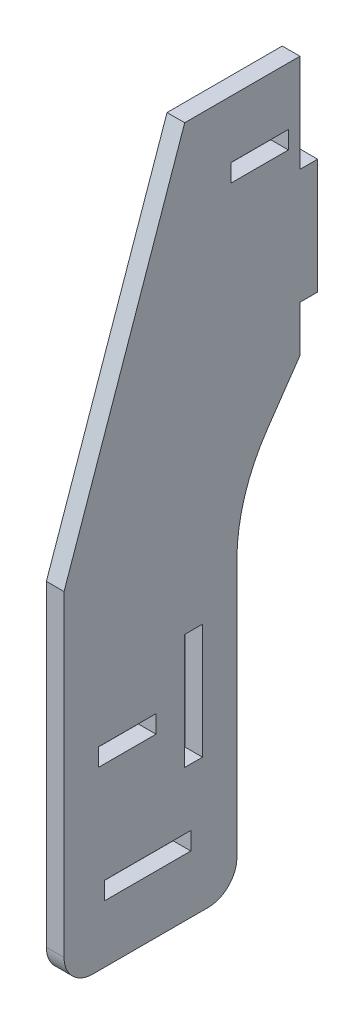
ISO-10303-21;
HEADER;
FILE_DESCRIPTION(('STEP AP214'),'2;1');
FILE_NAME('part.step','',(''),(''),'','','');
FILE_SCHEMA(('AUTOMOTIVE_DESIGN { 1 0 10303 214 1 1 1 1 }'));
ENDSEC;
DATA;
#1=APPLICATION_CONTEXT('core data for automotive mechanical design processes');
#2=APPLICATION_PROTOCOL_DEFINITION('international standard','automotive_design',2000,#1);
#3=PRODUCT_CONTEXT('',#1,'mechanical');
#4=PRODUCT('Part','Part','',(#3));
#5=PRODUCT_RELATED_PRODUCT_CATEGORY('part','',(#4));
#6=PRODUCT_DEFINITION_FORMATION('','',#4);
#7=PRODUCT_DEFINITION_CONTEXT('part definition',#1,'design');
#8=PRODUCT_DEFINITION('design','',#6,#7);
#9=PRODUCT_DEFINITION_SHAPE('','',#8);
#10=(LENGTH_UNIT() NAMED_UNIT(*) SI_UNIT(.MILLI.,.METRE.));
#11=(NAMED_UNIT(*) PLANE_ANGLE_UNIT() SI_UNIT($,.RADIAN.));
#12=(NAMED_UNIT(*) SI_UNIT($,.STERADIAN.) SOLID_ANGLE_UNIT());
#13=UNCERTAINTY_MEASURE_WITH_UNIT(LENGTH_MEASURE(1.E-05),#10,'distance_accuracy_value','');
#14=(GEOMETRIC_REPRESENTATION_CONTEXT(3) GLOBAL_UNCERTAINTY_ASSIGNED_CONTEXT((#13)) GLOBAL_UNIT_ASSIGNED_CONTEXT((#10,
#11,#12)) REPRESENTATION_CONTEXT('',''));
#15=CARTESIAN_POINT('',(0.,0.,0.));
#16=DIRECTION('',(0.,0.,1.));
#17=DIRECTION('',(1.,0.,0.));
#18=AXIS2_PLACEMENT_3D('',#15,#16,#17);
#19=CARTESIAN_POINT('',(38.9099999999999,-391.87,35.93));
#20=DIRECTION('',(-1.,0.,0.));
#21=DIRECTION('',(0.,0.,-1.));
#22=AXIS2_PLACEMENT_3D('',#19,#20,#21);
#23=PLANE('',#22);
#24=DIRECTION('',(0.,1.,0.));
#25=VECTOR('',#24,1.);
#26=CARTESIAN_POINT('',(38.9099999999999,-391.87,34.99));
#27=LINE('',#26,#25);
#28=CARTESIAN_POINT('',(38.9099999999999,-366.29,34.99));
#29=VERTEX_POINT('',#28);
#30=CARTESIAN_POINT('',(38.9099999999999,-363.2,34.99));
#31=VERTEX_POINT('',#30);
#32=EDGE_CURVE('E458',#29,#31,#27,.T.);
#33=ORIENTED_EDGE('',*,*,#32,.F.);
#34=DIRECTION('',(0.,0.,1.));
#35=VECTOR('',#34,1.);
#36=CARTESIAN_POINT('',(38.9099999999999,-366.29,35.93));
#37=LINE('',#36,#35);
#38=CARTESIAN_POINT('',(38.9099999999999,-366.29,24.97));
#39=VERTEX_POINT('',#38);
#40=EDGE_CURVE('E470',#39,#29,#37,.T.);
#41=ORIENTED_EDGE('',*,*,#40,.F.);
#42=DIRECTION('',(0.,-1.,0.));
#43=VECTOR('',#42,1.);
#44=CARTESIAN_POINT('',(38.9099999999999,-391.87,24.97));
#45=LINE('',#44,#43);
#46=CARTESIAN_POINT('',(38.9099999999999,-363.2,24.97));
#47=VERTEX_POINT('',#46);
#48=EDGE_CURVE('E249',#47,#39,#45,.T.);
#49=ORIENTED_EDGE('',*,*,#48,.F.);
#50=DIRECTION('',(0.,0.,-1.));
#51=VECTOR('',#50,1.);
#52=CARTESIAN_POINT('',(38.9099999999999,-363.2,35.93));
#53=LINE('',#52,#51);
#54=EDGE_CURVE('E467',#31,#47,#53,.T.);
#55=ORIENTED_EDGE('',*,*,#54,.F.);
#56=EDGE_LOOP('',(#33,#41,#49,#55));
#57=FACE_BOUND('',#56,.T.);
#58=DIRECTION('',(0.,1.,0.));
#59=VECTOR('',#58,1.);
#60=CARTESIAN_POINT('',(38.9099999999999,-391.87,19.99));
#61=LINE('',#60,#59);
#62=CARTESIAN_POINT('',(38.9099999999999,-373.78,19.99));
#63=VERTEX_POINT('',#62);
#64=CARTESIAN_POINT('',(38.9099999999999,-353.78,19.99));
#65=VERTEX_POINT('',#64);
#66=EDGE_CURVE('E438',#63,#65,#61,.T.);
#67=ORIENTED_EDGE('',*,*,#66,.F.);
#68=DIRECTION('',(0.,0.,1.));
#69=VECTOR('',#68,1.);
#70=CARTESIAN_POINT('',(38.9099999999999,-373.78,35.93));
#71=LINE('',#70,#69);
#72=CARTESIAN_POINT('',(38.9099999999999,-373.78,16.9));
#73=VERTEX_POINT('',#72);
#74=EDGE_CURVE('E448',#73,#63,#71,.T.);
#75=ORIENTED_EDGE('',*,*,#74,.F.);
#76=DIRECTION('',(0.,-1.,0.));
#77=VECTOR('',#76,1.);
#78=CARTESIAN_POINT('',(38.9099999999999,-391.87,16.9));
#79=LINE('',#78,#77);
#80=CARTESIAN_POINT('',(38.9099999999999,-353.78,16.9));
#81=VERTEX_POINT('',#80);
#82=EDGE_CURVE('E450',#81,#73,#79,.T.);
#83=ORIENTED_EDGE('',*,*,#82,.F.);
#84=DIRECTION('',(0.,0.,-1.));
#85=VECTOR('',#84,1.);
#86=CARTESIAN_POINT('',(38.9099999999999,-353.78,35.93));
#87=LINE('',#86,#85);
#88=EDGE_CURVE('E452',#65,#81,#87,.T.);
#89=ORIENTED_EDGE('',*,*,#88,.F.);
#90=EDGE_LOOP('',(#67,#75,#83,#89));
#91=FACE_BOUND('',#90,.T.);
#92=DIRECTION('',(0.,1.,0.));
#93=VECTOR('',#92,1.);
#94=CARTESIAN_POINT('',(38.9099999999999,-391.87,33.93));
#95=LINE('',#94,#93);
#96=CARTESIAN_POINT('',(38.9099999999999,-386.87,33.93));
#97=VERTEX_POINT('',#96);
#98=CARTESIAN_POINT('',(38.9099999999999,-383.78,33.93));
#99=VERTEX_POINT('',#98);
#100=EDGE_CURVE('E415',#97,#99,#95,.T.);
#101=ORIENTED_EDGE('',*,*,#100,.F.);
#102=DIRECTION('',(0.,0.,1.));
#103=VECTOR('',#102,1.);
#104=CARTESIAN_POINT('',(38.9099999999999,-386.87,35.93));
#105=LINE('',#104,#103);
#106=CARTESIAN_POINT('',(38.9099999999999,-386.87,18.93));
#107=VERTEX_POINT('',#106);
#108=EDGE_CURVE('E432',#107,#97,#105,.T.);
#109=ORIENTED_EDGE('',*,*,#108,.F.);
#110=DIRECTION('',(0.,-1.,0.));
#111=VECTOR('',#110,1.);
#112=CARTESIAN_POINT('',(38.9099999999999,-391.87,18.93));
#113=LINE('',#112,#111);
#114=CARTESIAN_POINT('',(38.9099999999999,-383.78,18.93));
#115=VERTEX_POINT('',#114);
#116=EDGE_CURVE('E429',#115,#107,#113,.T.);
#117=ORIENTED_EDGE('',*,*,#116,.F.);
#118=DIRECTION('',(0.,0.,-1.));
#119=VECTOR('',#118,1.);
#120=CARTESIAN_POINT('',(38.9099999999999,-383.78,35.93));
#121=LINE('',#120,#119);
#122=EDGE_CURVE('E427',#99,#115,#121,.T.);
#123=ORIENTED_EDGE('',*,*,#122,.F.);
#124=EDGE_LOOP('',(#101,#109,#117,#123));
#125=FACE_BOUND('',#124,.T.);
#126=DIRECTION('',(0.,1.,0.));
#127=VECTOR('',#126,1.);
#128=CARTESIAN_POINT('',(38.9099999999999,-313.86,-3.08));
#129=LINE('',#128,#127);
#130=CARTESIAN_POINT('',(38.9099999999999,-313.86,-3.08));
#131=VERTEX_POINT('',#130);
#132=CARTESIAN_POINT('',(38.9099999999999,-293.88,-3.08));
#133=VERTEX_POINT('',#132);
#134=EDGE_CURVE('E313',#131,#133,#129,.T.);
#135=ORIENTED_EDGE('',*,*,#134,.F.);
#136=DIRECTION('',(0.,0.,-1.));
#137=VECTOR('',#136,1.);
#138=CARTESIAN_POINT('',(38.9099999999999,-313.86,-3.08));
#139=LINE('',#138,#137);
#140=CARTESIAN_POINT('',(38.9099999999999,-313.86,-0.0100000000000005));
#141=VERTEX_POINT('',#140);
#142=EDGE_CURVE('E309',#141,#131,#139,.T.);
#143=ORIENTED_EDGE('',*,*,#142,.F.);
#144=DIRECTION('',(0.,1.,0.));
#145=VECTOR('',#144,1.);
#146=CARTESIAN_POINT('',(38.9099999999999,-313.86,-0.0100000000000005));
#147=LINE('',#146,#145);
#148=CARTESIAN_POINT('',(38.9099999999999,-321.87,-0.0100000000000005));
#149=VERTEX_POINT('',#148);
#150=EDGE_CURVE('E356',#149,#141,#147,.T.);
#151=ORIENTED_EDGE('',*,*,#150,.F.);
#152=DIRECTION('',(0.,0.824132399822139,-0.566397199466418));
#153=VECTOR('',#152,1.);
#154=CARTESIAN_POINT('',(38.9099999999999,-330.111323998221,5.6539719946642));
#155=LINE('',#154,#153);
#156=CARTESIAN_POINT('',(38.9099999999999,-330.111323998221,5.6539719946642));
#157=VERTEX_POINT('',#156);
#158=EDGE_CURVE('E359',#157,#149,#155,.T.);
#159=ORIENTED_EDGE('',*,*,#158,.F.);
#160=CARTESIAN_POINT('',(38.9099999999999,-347.103239982214,-19.07));
#161=DIRECTION('',(-1.,0.,0.));
#162=DIRECTION('',(0.,0.,1.));
#163=AXIS2_PLACEMENT_3D('',#160,#161,#162);
#164=CIRCLE('',#163,30.);
#165=CARTESIAN_POINT('',(38.9099999999999,-347.103239982214,10.93));
#166=VERTEX_POINT('',#165);
#167=EDGE_CURVE('E362',#166,#157,#164,.T.);
#168=ORIENTED_EDGE('',*,*,#167,.F.);
#169=DIRECTION('',(0.,1.,0.));
#170=VECTOR('',#169,1.);
#171=CARTESIAN_POINT('',(38.9099999999999,-391.87,10.93));
#172=LINE('',#171,#170);
#173=CARTESIAN_POINT('',(38.9099999999999,-391.87,10.93));
#174=VERTEX_POINT('',#173);
#175=EDGE_CURVE('E365',#174,#166,#172,.T.);
#176=ORIENTED_EDGE('',*,*,#175,.F.);
#177=CARTESIAN_POINT('',(38.9099999999999,-391.87,15.93));
#178=DIRECTION('',(1.,0.,0.));
#179=DIRECTION('',(0.,0.,-1.));
#180=AXIS2_PLACEMENT_3D('',#177,#178,#179);
#181=CIRCLE('',#180,5.);
#182=CARTESIAN_POINT('',(38.9099999999999,-396.87,15.93));
#183=VERTEX_POINT('',#182);
#184=EDGE_CURVE('E368',#183,#174,#181,.T.);
#185=ORIENTED_EDGE('',*,*,#184,.F.);
#186=DIRECTION('',(0.,0.,-1.));
#187=VECTOR('',#186,1.);
#188=CARTESIAN_POINT('',(38.9099999999999,-396.87,35.93));
#189=LINE('',#188,#187);
#190=CARTESIAN_POINT('',(38.9099999999999,-396.87,35.93));
#191=VERTEX_POINT('',#190);
#192=EDGE_CURVE('E371',#191,#183,#189,.T.);
#193=ORIENTED_EDGE('',*,*,#192,.F.);
#194=CARTESIAN_POINT('',(38.9099999999999,-391.87,35.93));
#195=DIRECTION('',(1.,0.,0.));
#196=DIRECTION('',(0.,0.,-1.));
#197=AXIS2_PLACEMENT_3D('',#194,#195,#196);
#198=CIRCLE('',#197,5.);
#199=CARTESIAN_POINT('',(38.9099999999999,-391.87,40.93));
#200=VERTEX_POINT('',#199);
#201=EDGE_CURVE('E374',#200,#191,#198,.T.);
#202=ORIENTED_EDGE('',*,*,#201,.F.);
#203=DIRECTION('',(0.,-1.,0.));
#204=VECTOR('',#203,1.);
#205=CARTESIAN_POINT('',(38.9099999999999,-391.87,40.93));
#206=LINE('',#205,#204);
#207=CARTESIAN_POINT('',(38.9099999999999,-336.87,40.93));
#208=VERTEX_POINT('',#207);
#209=EDGE_CURVE('E377',#208,#200,#206,.T.);
#210=ORIENTED_EDGE('',*,*,#209,.F.);
#211=DIRECTION('',(0.,-0.944152372082089,0.329509177856649));
#212=VECTOR('',#211,1.);
#213=CARTESIAN_POINT('',(38.9099999999999,-336.87,40.93));
#214=LINE('',#213,#212);
#215=CARTESIAN_POINT('',(38.9099999999999,-276.87,19.99));
#216=VERTEX_POINT('',#215);
#217=EDGE_CURVE('E380',#216,#208,#214,.T.);
#218=ORIENTED_EDGE('',*,*,#217,.F.);
#219=DIRECTION('',(0.,0.,1.));
#220=VECTOR('',#219,1.);
#221=CARTESIAN_POINT('',(38.9099999999999,-276.87,-0.0100000000000005));
#222=LINE('',#221,#220);
#223=CARTESIAN_POINT('',(38.9099999999999,-276.87,-0.0100000000000005));
#224=VERTEX_POINT('',#223);
#225=EDGE_CURVE('E383',#224,#216,#222,.T.);
#226=ORIENTED_EDGE('',*,*,#225,.F.);
#227=DIRECTION('',(0.,1.,0.));
#228=VECTOR('',#227,1.);
#229=CARTESIAN_POINT('',(38.9099999999999,-293.88,-0.0100000000000005));
#230=LINE('',#229,#228);
#231=CARTESIAN_POINT('',(38.9099999999999,-293.88,-0.0100000000000005));
#232=VERTEX_POINT('',#231);
#233=EDGE_CURVE('E386',#232,#224,#230,.T.);
#234=ORIENTED_EDGE('',*,*,#233,.F.);
#235=DIRECTION('',(0.,0.,1.));
#236=VECTOR('',#235,1.);
#237=CARTESIAN_POINT('',(38.9099999999999,-293.88,-3.08));
#238=LINE('',#237,#236);
#239=EDGE_CURVE('E389',#133,#232,#238,.T.);
#240=ORIENTED_EDGE('',*,*,#239,.F.);
#241=EDGE_LOOP('',(#135,#143,#151,#159,#168,#176,#185,#193,#202,#210,#218,#226,#234,#240));
#242=FACE_BOUND('',#241,.T.);
#243=DIRECTION('',(0.,0.,-1.));
#244=VECTOR('',#243,1.);
#245=CARTESIAN_POINT('',(38.9099999999999,-289.96,11.99));
#246=LINE('',#245,#244);
#247=CARTESIAN_POINT('',(38.9099999999999,-289.96,11.99));
#248=VERTEX_POINT('',#247);
#249=CARTESIAN_POINT('',(38.9099999999999,-289.96,1.99000000000001));
#250=VERTEX_POINT('',#249);
#251=EDGE_CURVE('E421',#248,#250,#246,.T.);
#252=ORIENTED_EDGE('',*,*,#251,.T.);
#253=DIRECTION('',(0.,1.,0.));
#254=VECTOR('',#253,1.);
#255=CARTESIAN_POINT('',(38.9099999999999,-289.96,1.99000000000001));
#256=LINE('',#255,#254);
#257=CARTESIAN_POINT('',(38.9099999999999,-286.87,1.99000000000001));
#258=VERTEX_POINT('',#257);
#259=EDGE_CURVE('E418',#250,#258,#256,.T.);
#260=ORIENTED_EDGE('',*,*,#259,.T.);
#261=DIRECTION('',(0.,0.,1.));
#262=VECTOR('',#261,1.);
#263=CARTESIAN_POINT('',(38.9099999999999,-286.87,11.99));
#264=LINE('',#263,#262);
#265=CARTESIAN_POINT('',(38.9099999999999,-286.87,11.99));
#266=VERTEX_POINT('',#265);
#267=EDGE_CURVE('E401',#258,#266,#264,.T.);
#268=ORIENTED_EDGE('',*,*,#267,.T.);
#269=DIRECTION('',(0.,-1.,0.));
#270=VECTOR('',#269,1.);
#271=CARTESIAN_POINT('',(38.9099999999999,-289.96,11.99));
#272=LINE('',#271,#270);
#273=EDGE_CURVE('E405',#266,#248,#272,.T.);
#274=ORIENTED_EDGE('',*,*,#273,.T.);
#275=EDGE_LOOP('',(#252,#260,#268,#274));
#276=FACE_BOUND('',#275,.T.);
#277=ADVANCED_FACE('F43',(#57,#91,#125,#242,#276),#23,.T.);
#278=CARTESIAN_POINT('',(41.9799999999999,-391.87,35.93));
#279=DIRECTION('',(-1.,0.,0.));
#280=DIRECTION('',(0.,0.,-1.));
#281=AXIS2_PLACEMENT_3D('',#278,#279,#280);
#282=PLANE('',#281);
#283=DIRECTION('',(0.,0.,1.));
#284=VECTOR('',#283,1.);
#285=CARTESIAN_POINT('',(41.9799999999999,-366.29,35.93));
#286=LINE('',#285,#284);
#287=CARTESIAN_POINT('',(41.9799999999999,-366.29,24.97));
#288=VERTEX_POINT('',#287);
#289=CARTESIAN_POINT('',(41.9799999999999,-366.29,34.99));
#290=VERTEX_POINT('',#289);
#291=EDGE_CURVE('E237',#288,#290,#286,.T.);
#292=ORIENTED_EDGE('',*,*,#291,.T.);
#293=DIRECTION('',(0.,1.,0.));
#294=VECTOR('',#293,1.);
#295=CARTESIAN_POINT('',(41.9799999999999,-391.87,34.99));
#296=LINE('',#295,#294);
#297=CARTESIAN_POINT('',(41.9799999999999,-363.2,34.99));
#298=VERTEX_POINT('',#297);
#299=EDGE_CURVE('E11',#290,#298,#296,.T.);
#300=ORIENTED_EDGE('',*,*,#299,.T.);
#301=DIRECTION('',(0.,0.,-1.));
#302=VECTOR('',#301,1.);
#303=CARTESIAN_POINT('',(41.9799999999999,-363.2,35.93));
#304=LINE('',#303,#302);
#305=CARTESIAN_POINT('',(41.9799999999999,-363.2,24.97));
#306=VERTEX_POINT('',#305);
#307=EDGE_CURVE('E51',#298,#306,#304,.T.);
#308=ORIENTED_EDGE('',*,*,#307,.T.);
#309=DIRECTION('',(0.,-1.,0.));
#310=VECTOR('',#309,1.);
#311=CARTESIAN_POINT('',(41.9799999999999,-391.87,24.97));
#312=LINE('',#311,#310);
#313=EDGE_CURVE('E241',#306,#288,#312,.T.);
#314=ORIENTED_EDGE('',*,*,#313,.T.);
#315=EDGE_LOOP('',(#292,#300,#308,#314));
#316=FACE_BOUND('',#315,.T.);
#317=DIRECTION('',(0.,0.,1.));
#318=VECTOR('',#317,1.);
#319=CARTESIAN_POINT('',(41.9799999999999,-373.78,35.93));
#320=LINE('',#319,#318);
#321=CARTESIAN_POINT('',(41.9799999999999,-373.78,16.9));
#322=VERTEX_POINT('',#321);
#323=CARTESIAN_POINT('',(41.9799999999999,-373.78,19.99));
#324=VERTEX_POINT('',#323);
#325=EDGE_CURVE('E260',#322,#324,#320,.T.);
#326=ORIENTED_EDGE('',*,*,#325,.T.);
#327=DIRECTION('',(0.,1.,0.));
#328=VECTOR('',#327,1.);
#329=CARTESIAN_POINT('',(41.9799999999999,-391.87,19.99));
#330=LINE('',#329,#328);
#331=CARTESIAN_POINT('',(41.9799999999999,-353.78,19.99));
#332=VERTEX_POINT('',#331);
#333=EDGE_CURVE('E242',#324,#332,#330,.T.);
#334=ORIENTED_EDGE('',*,*,#333,.T.);
#335=DIRECTION('',(0.,0.,-1.));
#336=VECTOR('',#335,1.);
#337=CARTESIAN_POINT('',(41.9799999999999,-353.78,35.93));
#338=LINE('',#337,#336);
#339=CARTESIAN_POINT('',(41.9799999999999,-353.78,16.9));
#340=VERTEX_POINT('',#339);
#341=EDGE_CURVE('E266',#332,#340,#338,.T.);
#342=ORIENTED_EDGE('',*,*,#341,.T.);
#343=DIRECTION('',(0.,-1.,0.));
#344=VECTOR('',#343,1.);
#345=CARTESIAN_POINT('',(41.9799999999999,-391.87,16.9));
#346=LINE('',#345,#344);
#347=EDGE_CURVE('E263',#340,#322,#346,.T.);
#348=ORIENTED_EDGE('',*,*,#347,.T.);
#349=EDGE_LOOP('',(#326,#334,#342,#348));
#350=FACE_BOUND('',#349,.T.);
#351=DIRECTION('',(0.,0.,1.));
#352=VECTOR('',#351,1.);
#353=CARTESIAN_POINT('',(41.9799999999999,-386.87,35.93));
#354=LINE('',#353,#352);
#355=CARTESIAN_POINT('',(41.9799999999999,-386.87,18.93));
#356=VERTEX_POINT('',#355);
#357=CARTESIAN_POINT('',(41.9799999999999,-386.87,33.93));
#358=VERTEX_POINT('',#357);
#359=EDGE_CURVE('E278',#356,#358,#354,.T.);
#360=ORIENTED_EDGE('',*,*,#359,.T.);
#361=DIRECTION('',(0.,1.,0.));
#362=VECTOR('',#361,1.);
#363=CARTESIAN_POINT('',(41.9799999999999,-391.87,33.93));
#364=LINE('',#363,#362);
#365=CARTESIAN_POINT('',(41.9799999999999,-383.78,33.93));
#366=VERTEX_POINT('',#365);
#367=EDGE_CURVE('E269',#358,#366,#364,.T.);
#368=ORIENTED_EDGE('',*,*,#367,.T.);
#369=DIRECTION('',(0.,0.,-1.));
#370=VECTOR('',#369,1.);
#371=CARTESIAN_POINT('',(41.9799999999999,-383.78,35.93));
#372=LINE('',#371,#370);
#373=CARTESIAN_POINT('',(41.9799999999999,-383.78,18.93));
#374=VERTEX_POINT('',#373);
#375=EDGE_CURVE('E272',#366,#374,#372,.T.);
#376=ORIENTED_EDGE('',*,*,#375,.T.);
#377=DIRECTION('',(0.,-1.,0.));
#378=VECTOR('',#377,1.);
#379=CARTESIAN_POINT('',(41.9799999999999,-391.87,18.93));
#380=LINE('',#379,#378);
#381=EDGE_CURVE('E275',#374,#356,#380,.T.);
#382=ORIENTED_EDGE('',*,*,#381,.T.);
#383=EDGE_LOOP('',(#360,#368,#376,#382));
#384=FACE_BOUND('',#383,.T.);
#385=DIRECTION('',(0.,1.,0.));
#386=VECTOR('',#385,1.);
#387=CARTESIAN_POINT('',(41.9799999999999,-313.86,-3.08));
#388=LINE('',#387,#386);
#389=CARTESIAN_POINT('',(41.9799999999999,-313.86,-3.08));
#390=VERTEX_POINT('',#389);
#391=CARTESIAN_POINT('',(41.9799999999999,-293.88,-3.08));
#392=VERTEX_POINT('',#391);
#393=EDGE_CURVE('E350',#390,#392,#388,.T.);
#394=ORIENTED_EDGE('',*,*,#393,.T.);
#395=DIRECTION('',(0.,0.,1.));
#396=VECTOR('',#395,1.);
#397=CARTESIAN_POINT('',(41.9799999999999,-293.88,-3.08));
#398=LINE('',#397,#396);
#399=CARTESIAN_POINT('',(41.9799999999999,-293.88,-0.0100000000000005));
#400=VERTEX_POINT('',#399);
#401=EDGE_CURVE('E347',#392,#400,#398,.T.);
#402=ORIENTED_EDGE('',*,*,#401,.T.);
#403=DIRECTION('',(0.,1.,0.));
#404=VECTOR('',#403,1.);
#405=CARTESIAN_POINT('',(41.9799999999999,-293.88,-0.0100000000000005));
#406=LINE('',#405,#404);
#407=CARTESIAN_POINT('',(41.9799999999999,-276.87,-0.0100000000000005));
#408=VERTEX_POINT('',#407);
#409=EDGE_CURVE('E344',#400,#408,#406,.T.);
#410=ORIENTED_EDGE('',*,*,#409,.T.);
#411=DIRECTION('',(0.,0.,1.));
#412=VECTOR('',#411,1.);
#413=CARTESIAN_POINT('',(41.9799999999999,-276.87,-0.0100000000000005));
#414=LINE('',#413,#412);
#415=CARTESIAN_POINT('',(41.9799999999999,-276.87,19.99));
#416=VERTEX_POINT('',#415);
#417=EDGE_CURVE('E341',#408,#416,#414,.T.);
#418=ORIENTED_EDGE('',*,*,#417,.T.);
#419=DIRECTION('',(0.,-0.944152372082089,0.329509177856649));
#420=VECTOR('',#419,1.);
#421=CARTESIAN_POINT('',(41.9799999999999,-336.87,40.93));
#422=LINE('',#421,#420);
#423=CARTESIAN_POINT('',(41.9799999999999,-336.87,40.93));
#424=VERTEX_POINT('',#423);
#425=EDGE_CURVE('E338',#416,#424,#422,.T.);
#426=ORIENTED_EDGE('',*,*,#425,.T.);
#427=DIRECTION('',(0.,-1.,0.));
#428=VECTOR('',#427,1.);
#429=CARTESIAN_POINT('',(41.9799999999999,-391.87,40.93));
#430=LINE('',#429,#428);
#431=CARTESIAN_POINT('',(41.9799999999999,-391.87,40.93));
#432=VERTEX_POINT('',#431);
#433=EDGE_CURVE('E335',#424,#432,#430,.T.);
#434=ORIENTED_EDGE('',*,*,#433,.T.);
#435=CARTESIAN_POINT('',(41.9799999999999,-391.87,35.93));
#436=DIRECTION('',(1.,0.,0.));
#437=DIRECTION('',(0.,0.,-1.));
#438=AXIS2_PLACEMENT_3D('',#435,#436,#437);
#439=CIRCLE('',#438,5.);
#440=CARTESIAN_POINT('',(41.9799999999999,-396.87,35.93));
#441=VERTEX_POINT('',#440);
#442=EDGE_CURVE('E332',#432,#441,#439,.T.);
#443=ORIENTED_EDGE('',*,*,#442,.T.);
#444=DIRECTION('',(0.,0.,-1.));
#445=VECTOR('',#444,1.);
#446=CARTESIAN_POINT('',(41.9799999999999,-396.87,35.93));
#447=LINE('',#446,#445);
#448=CARTESIAN_POINT('',(41.9799999999999,-396.87,15.93));
#449=VERTEX_POINT('',#448);
#450=EDGE_CURVE('E329',#441,#449,#447,.T.);
#451=ORIENTED_EDGE('',*,*,#450,.T.);
#452=CARTESIAN_POINT('',(41.9799999999999,-391.87,15.93));
#453=DIRECTION('',(1.,0.,0.));
#454=DIRECTION('',(0.,0.,-1.));
#455=AXIS2_PLACEMENT_3D('',#452,#453,#454);
#456=CIRCLE('',#455,5.);
#457=CARTESIAN_POINT('',(41.9799999999999,-391.87,10.93));
#458=VERTEX_POINT('',#457);
#459=EDGE_CURVE('E326',#449,#458,#456,.T.);
#460=ORIENTED_EDGE('',*,*,#459,.T.);
#461=DIRECTION('',(0.,1.,0.));
#462=VECTOR('',#461,1.);
#463=CARTESIAN_POINT('',(41.9799999999999,-391.87,10.93));
#464=LINE('',#463,#462);
#465=CARTESIAN_POINT('',(41.9799999999999,-347.103239982214,10.93));
#466=VERTEX_POINT('',#465);
#467=EDGE_CURVE('E323',#458,#466,#464,.T.);
#468=ORIENTED_EDGE('',*,*,#467,.T.);
#469=CARTESIAN_POINT('',(41.9799999999999,-347.103239982214,-19.07));
#470=DIRECTION('',(-1.,0.,0.));
#471=DIRECTION('',(0.,0.,1.));
#472=AXIS2_PLACEMENT_3D('',#469,#470,#471);
#473=CIRCLE('',#472,30.);
#474=CARTESIAN_POINT('',(41.9799999999999,-330.111323998221,5.6539719946642));
#475=VERTEX_POINT('',#474);
#476=EDGE_CURVE('E320',#466,#475,#473,.T.);
#477=ORIENTED_EDGE('',*,*,#476,.T.);
#478=DIRECTION('',(0.,0.824132399822139,-0.566397199466418));
#479=VECTOR('',#478,1.);
#480=CARTESIAN_POINT('',(41.9799999999999,-330.111323998221,5.6539719946642));
#481=LINE('',#480,#479);
#482=CARTESIAN_POINT('',(41.9799999999999,-321.87,-0.0100000000000005));
#483=VERTEX_POINT('',#482);
#484=EDGE_CURVE('E317',#475,#483,#481,.T.);
#485=ORIENTED_EDGE('',*,*,#484,.T.);
#486=DIRECTION('',(0.,1.,0.));
#487=VECTOR('',#486,1.);
#488=CARTESIAN_POINT('',(41.9799999999999,-313.86,-0.0100000000000005));
#489=LINE('',#488,#487);
#490=CARTESIAN_POINT('',(41.9799999999999,-313.86,-0.0100000000000005));
#491=VERTEX_POINT('',#490);
#492=EDGE_CURVE('E314',#483,#491,#489,.T.);
#493=ORIENTED_EDGE('',*,*,#492,.T.);
#494=DIRECTION('',(0.,0.,-1.));
#495=VECTOR('',#494,1.);
#496=CARTESIAN_POINT('',(41.9799999999999,-313.86,-3.08));
#497=LINE('',#496,#495);
#498=EDGE_CURVE('E310',#491,#390,#497,.T.);
#499=ORIENTED_EDGE('',*,*,#498,.T.);
#500=EDGE_LOOP('',(#394,#402,#410,#418,#426,#434,#443,#451,#460,#468,#477,#485,#493,#499));
#501=FACE_BOUND('',#500,.T.);
#502=DIRECTION('',(0.,-1.,0.));
#503=VECTOR('',#502,1.);
#504=CARTESIAN_POINT('',(41.9799999999999,-289.96,11.99));
#505=LINE('',#504,#503);
#506=CARTESIAN_POINT('',(41.9799999999999,-286.87,11.99));
#507=VERTEX_POINT('',#506);
#508=CARTESIAN_POINT('',(41.9799999999999,-289.96,11.99));
#509=VERTEX_POINT('',#508);
#510=EDGE_CURVE('E412',#507,#509,#505,.T.);
#511=ORIENTED_EDGE('',*,*,#510,.F.);
#512=DIRECTION('',(0.,0.,1.));
#513=VECTOR('',#512,1.);
#514=CARTESIAN_POINT('',(41.9799999999999,-286.87,11.99));
#515=LINE('',#514,#513);
#516=CARTESIAN_POINT('',(41.9799999999999,-286.87,1.99000000000001));
#517=VERTEX_POINT('',#516);
#518=EDGE_CURVE('E402',#517,#507,#515,.T.);
#519=ORIENTED_EDGE('',*,*,#518,.F.);
#520=DIRECTION('',(0.,1.,0.));
#521=VECTOR('',#520,1.);
#522=CARTESIAN_POINT('',(41.9799999999999,-289.96,1.99000000000001));
#523=LINE('',#522,#521);
#524=CARTESIAN_POINT('',(41.9799999999999,-289.96,1.99000000000001));
#525=VERTEX_POINT('',#524);
#526=EDGE_CURVE('E406',#525,#517,#523,.T.);
#527=ORIENTED_EDGE('',*,*,#526,.F.);
#528=DIRECTION('',(0.,0.,-1.));
#529=VECTOR('',#528,1.);
#530=CARTESIAN_POINT('',(41.9799999999999,-289.96,11.99));
#531=LINE('',#530,#529);
#532=EDGE_CURVE('E409',#509,#525,#531,.T.);
#533=ORIENTED_EDGE('',*,*,#532,.F.);
#534=EDGE_LOOP('',(#511,#519,#527,#533));
#535=FACE_BOUND('',#534,.T.);
#536=ADVANCED_FACE('F254',(#316,#350,#384,#501,#535),#282,.F.);
#537=CARTESIAN_POINT('',(38.9099999999999,-313.86,-3.08));
#538=DIRECTION('',(0.,0.,1.));
#539=DIRECTION('',(0.,-1.,0.));
#540=AXIS2_PLACEMENT_3D('',#537,#538,#539);
#541=PLANE('',#540);
#542=ORIENTED_EDGE('',*,*,#393,.F.);
#543=DIRECTION('',(1.,0.,0.));
#544=VECTOR('',#543,1.);
#545=CARTESIAN_POINT('',(38.9099999999999,-313.86,-3.08));
#546=LINE('',#545,#544);
#547=EDGE_CURVE('E307',#131,#390,#546,.T.);
#548=ORIENTED_EDGE('',*,*,#547,.F.);
#549=ORIENTED_EDGE('',*,*,#134,.T.);
#550=DIRECTION('',(1.,0.,0.));
#551=VECTOR('',#550,1.);
#552=CARTESIAN_POINT('',(38.9099999999999,-293.88,-3.08));
#553=LINE('',#552,#551);
#554=EDGE_CURVE('E281',#133,#392,#553,.T.);
#555=ORIENTED_EDGE('',*,*,#554,.T.);
#556=EDGE_LOOP('',(#542,#548,#549,#555));
#557=FACE_BOUND('',#556,.T.);
#558=ADVANCED_FACE('F45',(#557),#541,.F.);
#559=CARTESIAN_POINT('',(38.9099999999999,-293.88,-3.08));
#560=DIRECTION('',(0.,-1.,0.));
#561=DIRECTION('',(0.,0.,-1.));
#562=AXIS2_PLACEMENT_3D('',#559,#560,#561);
#563=PLANE('',#562);
#564=ORIENTED_EDGE('',*,*,#401,.F.);
#565=ORIENTED_EDGE('',*,*,#554,.F.);
#566=ORIENTED_EDGE('',*,*,#239,.T.);
#567=DIRECTION('',(1.,0.,0.));
#568=VECTOR('',#567,1.);
#569=CARTESIAN_POINT('',(38.9099999999999,-293.88,-0.0100000000000005));
#570=LINE('',#569,#568);
#571=EDGE_CURVE('E283',#232,#400,#570,.T.);
#572=ORIENTED_EDGE('',*,*,#571,.T.);
#573=EDGE_LOOP('',(#564,#565,#566,#572));
#574=FACE_BOUND('',#573,.T.);
#575=ADVANCED_FACE('F522',(#574),#563,.F.);
#576=CARTESIAN_POINT('',(38.9099999999999,-293.88,-0.0100000000000005));
#577=DIRECTION('',(0.,0.,1.));
#578=DIRECTION('',(-1.,0.,0.));
#579=AXIS2_PLACEMENT_3D('',#576,#577,#578);
#580=PLANE('',#579);
#581=ORIENTED_EDGE('',*,*,#409,.F.);
#582=ORIENTED_EDGE('',*,*,#571,.F.);
#583=ORIENTED_EDGE('',*,*,#233,.T.);
#584=DIRECTION('',(1.,0.,0.));
#585=VECTOR('',#584,1.);
#586=CARTESIAN_POINT('',(38.9099999999999,-276.87,-0.0100000000000005));
#587=LINE('',#586,#585);
#588=EDGE_CURVE('E285',#224,#408,#587,.T.);
#589=ORIENTED_EDGE('',*,*,#588,.T.);
#590=EDGE_LOOP('',(#581,#582,#583,#589));
#591=FACE_BOUND('',#590,.T.);
#592=ADVANCED_FACE('F569',(#591),#580,.F.);
#593=CARTESIAN_POINT('',(38.9099999999999,-276.87,-0.0100000000000005));
#594=DIRECTION('',(0.,-1.,0.));
#595=DIRECTION('',(0.,0.,-1.));
#596=AXIS2_PLACEMENT_3D('',#593,#594,#595);
#597=PLANE('',#596);
#598=ORIENTED_EDGE('',*,*,#417,.F.);
#599=ORIENTED_EDGE('',*,*,#588,.F.);
#600=ORIENTED_EDGE('',*,*,#225,.T.);
#601=DIRECTION('',(1.,0.,0.));
#602=VECTOR('',#601,1.);
#603=CARTESIAN_POINT('',(38.9099999999999,-276.87,19.99));
#604=LINE('',#603,#602);
#605=EDGE_CURVE('E287',#216,#416,#604,.T.);
#606=ORIENTED_EDGE('',*,*,#605,.T.);
#607=EDGE_LOOP('',(#598,#599,#600,#606));
#608=FACE_BOUND('',#607,.T.);
#609=ADVANCED_FACE('F565',(#608),#597,.F.);
#610=CARTESIAN_POINT('',(38.9099999999999,-336.87,40.93));
#611=DIRECTION('',(0.,-0.329509177856649,-0.944152372082089));
#612=DIRECTION('',(0.,0.944152372082089,-0.329509177856649));
#613=AXIS2_PLACEMENT_3D('',#610,#611,#612);
#614=PLANE('',#613);
#615=ORIENTED_EDGE('',*,*,#425,.F.);
#616=ORIENTED_EDGE('',*,*,#605,.F.);
#617=ORIENTED_EDGE('',*,*,#217,.T.);
#618=DIRECTION('',(1.,0.,0.));
#619=VECTOR('',#618,1.);
#620=CARTESIAN_POINT('',(38.9099999999999,-336.87,40.93));
#621=LINE('',#620,#619);
#622=EDGE_CURVE('E289',#208,#424,#621,.T.);
#623=ORIENTED_EDGE('',*,*,#622,.T.);
#624=EDGE_LOOP('',(#615,#616,#617,#623));
#625=FACE_BOUND('',#624,.T.);
#626=ADVANCED_FACE('F561',(#625),#614,.F.);
#627=CARTESIAN_POINT('',(38.9099999999999,-391.87,40.93));
#628=DIRECTION('',(0.,0.,-1.));
#629=DIRECTION('',(1.,0.,0.));
#630=AXIS2_PLACEMENT_3D('',#627,#628,#629);
#631=PLANE('',#630);
#632=ORIENTED_EDGE('',*,*,#433,.F.);
#633=ORIENTED_EDGE('',*,*,#622,.F.);
#634=ORIENTED_EDGE('',*,*,#209,.T.);
#635=DIRECTION('',(1.,0.,0.));
#636=VECTOR('',#635,1.);
#637=CARTESIAN_POINT('',(38.9099999999999,-391.87,40.93));
#638=LINE('',#637,#636);
#639=EDGE_CURVE('E291',#200,#432,#638,.T.);
#640=ORIENTED_EDGE('',*,*,#639,.T.);
#641=EDGE_LOOP('',(#632,#633,#634,#640));
#642=FACE_BOUND('',#641,.T.);
#643=ADVANCED_FACE('F557',(#642),#631,.F.);
#644=CARTESIAN_POINT('',(38.9099999999999,-391.87,35.93));
#645=DIRECTION('',(1.,0.,0.));
#646=DIRECTION('',(0.,0.,1.));
#647=AXIS2_PLACEMENT_3D('',#644,#645,#646);
#648=CYLINDRICAL_SURFACE('',#647,5.);
#649=ORIENTED_EDGE('',*,*,#442,.F.);
#650=ORIENTED_EDGE('',*,*,#639,.F.);
#651=ORIENTED_EDGE('',*,*,#201,.T.);
#652=DIRECTION('',(1.,0.,0.));
#653=VECTOR('',#652,1.);
#654=CARTESIAN_POINT('',(38.9099999999999,-396.87,35.93));
#655=LINE('',#654,#653);
#656=EDGE_CURVE('E293',#191,#441,#655,.T.);
#657=ORIENTED_EDGE('',*,*,#656,.T.);
#658=EDGE_LOOP('',(#649,#650,#651,#657));
#659=FACE_BOUND('',#658,.T.);
#660=ADVANCED_FACE('F553',(#659),#648,.T.);
#661=CARTESIAN_POINT('',(38.9099999999999,-396.87,35.93));
#662=DIRECTION('',(0.,1.,0.));
#663=DIRECTION('',(0.,0.,1.));
#664=AXIS2_PLACEMENT_3D('',#661,#662,#663);
#665=PLANE('',#664);
#666=ORIENTED_EDGE('',*,*,#450,.F.);
#667=ORIENTED_EDGE('',*,*,#656,.F.);
#668=ORIENTED_EDGE('',*,*,#192,.T.);
#669=DIRECTION('',(1.,0.,0.));
#670=VECTOR('',#669,1.);
#671=CARTESIAN_POINT('',(38.9099999999999,-396.87,15.93));
#672=LINE('',#671,#670);
#673=EDGE_CURVE('E295',#183,#449,#672,.T.);
#674=ORIENTED_EDGE('',*,*,#673,.T.);
#675=EDGE_LOOP('',(#666,#667,#668,#674));
#676=FACE_BOUND('',#675,.T.);
#677=ADVANCED_FACE('F549',(#676),#665,.F.);
#678=CARTESIAN_POINT('',(38.9099999999999,-391.87,15.93));
#679=DIRECTION('',(1.,0.,0.));
#680=DIRECTION('',(0.,0.,1.));
#681=AXIS2_PLACEMENT_3D('',#678,#679,#680);
#682=CYLINDRICAL_SURFACE('',#681,5.);
#683=ORIENTED_EDGE('',*,*,#459,.F.);
#684=ORIENTED_EDGE('',*,*,#673,.F.);
#685=ORIENTED_EDGE('',*,*,#184,.T.);
#686=DIRECTION('',(1.,0.,0.));
#687=VECTOR('',#686,1.);
#688=CARTESIAN_POINT('',(38.9099999999999,-391.87,10.93));
#689=LINE('',#688,#687);
#690=EDGE_CURVE('E297',#174,#458,#689,.T.);
#691=ORIENTED_EDGE('',*,*,#690,.T.);
#692=EDGE_LOOP('',(#683,#684,#685,#691));
#693=FACE_BOUND('',#692,.T.);
#694=ADVANCED_FACE('F545',(#693),#682,.T.);
#695=CARTESIAN_POINT('',(38.9099999999999,-391.87,10.93));
#696=DIRECTION('',(0.,0.,1.));
#697=DIRECTION('',(0.,-1.,0.));
#698=AXIS2_PLACEMENT_3D('',#695,#696,#697);
#699=PLANE('',#698);
#700=ORIENTED_EDGE('',*,*,#467,.F.);
#701=ORIENTED_EDGE('',*,*,#690,.F.);
#702=ORIENTED_EDGE('',*,*,#175,.T.);
#703=DIRECTION('',(1.,0.,0.));
#704=VECTOR('',#703,1.);
#705=CARTESIAN_POINT('',(38.9099999999999,-347.103239982214,10.93));
#706=LINE('',#705,#704);
#707=EDGE_CURVE('E299',#166,#466,#706,.T.);
#708=ORIENTED_EDGE('',*,*,#707,.T.);
#709=EDGE_LOOP('',(#700,#701,#702,#708));
#710=FACE_BOUND('',#709,.T.);
#711=ADVANCED_FACE('F541',(#710),#699,.F.);
#712=CARTESIAN_POINT('',(38.9099999999999,-347.103239982214,-19.07));
#713=DIRECTION('',(1.,0.,0.));
#714=DIRECTION('',(0.,0.,1.));
#715=AXIS2_PLACEMENT_3D('',#712,#713,#714);
#716=CYLINDRICAL_SURFACE('',#715,30.);
#717=ORIENTED_EDGE('',*,*,#476,.F.);
#718=ORIENTED_EDGE('',*,*,#707,.F.);
#719=ORIENTED_EDGE('',*,*,#167,.T.);
#720=DIRECTION('',(1.,0.,0.));
#721=VECTOR('',#720,1.);
#722=CARTESIAN_POINT('',(38.9099999999999,-330.111323998221,5.6539719946642));
#723=LINE('',#722,#721);
#724=EDGE_CURVE('E301',#157,#475,#723,.T.);
#725=ORIENTED_EDGE('',*,*,#724,.T.);
#726=EDGE_LOOP('',(#717,#718,#719,#725));
#727=FACE_BOUND('',#726,.T.);
#728=ADVANCED_FACE('F537',(#727),#716,.F.);
#729=CARTESIAN_POINT('',(38.9099999999999,-330.111323998221,5.6539719946642));
#730=DIRECTION('',(0.,0.566397199466418,0.824132399822139));
#731=DIRECTION('',(0.,-0.824132399822139,0.566397199466418));
#732=AXIS2_PLACEMENT_3D('',#729,#730,#731);
#733=PLANE('',#732);
#734=ORIENTED_EDGE('',*,*,#484,.F.);
#735=ORIENTED_EDGE('',*,*,#724,.F.);
#736=ORIENTED_EDGE('',*,*,#158,.T.);
#737=DIRECTION('',(1.,0.,0.));
#738=VECTOR('',#737,1.);
#739=CARTESIAN_POINT('',(38.9099999999999,-321.87,-0.0100000000000005));
#740=LINE('',#739,#738);
#741=EDGE_CURVE('E303',#149,#483,#740,.T.);
#742=ORIENTED_EDGE('',*,*,#741,.T.);
#743=EDGE_LOOP('',(#734,#735,#736,#742));
#744=FACE_BOUND('',#743,.T.);
#745=ADVANCED_FACE('F533',(#744),#733,.F.);
#746=CARTESIAN_POINT('',(38.9099999999999,-313.86,-0.0100000000000005));
#747=DIRECTION('',(0.,0.,1.));
#748=DIRECTION('',(-1.,0.,0.));
#749=AXIS2_PLACEMENT_3D('',#746,#747,#748);
#750=PLANE('',#749);
#751=ORIENTED_EDGE('',*,*,#492,.F.);
#752=ORIENTED_EDGE('',*,*,#741,.F.);
#753=ORIENTED_EDGE('',*,*,#150,.T.);
#754=DIRECTION('',(1.,0.,0.));
#755=VECTOR('',#754,1.);
#756=CARTESIAN_POINT('',(38.9099999999999,-313.86,-0.0100000000000005));
#757=LINE('',#756,#755);
#758=EDGE_CURVE('E305',#141,#491,#757,.T.);
#759=ORIENTED_EDGE('',*,*,#758,.T.);
#760=EDGE_LOOP('',(#751,#752,#753,#759));
#761=FACE_BOUND('',#760,.T.);
#762=ADVANCED_FACE('F529',(#761),#750,.F.);
#763=CARTESIAN_POINT('',(38.9099999999999,-313.86,-3.08));
#764=DIRECTION('',(0.,1.,0.));
#765=DIRECTION('',(0.,0.,1.));
#766=AXIS2_PLACEMENT_3D('',#763,#764,#765);
#767=PLANE('',#766);
#768=ORIENTED_EDGE('',*,*,#498,.F.);
#769=ORIENTED_EDGE('',*,*,#758,.F.);
#770=ORIENTED_EDGE('',*,*,#142,.T.);
#771=ORIENTED_EDGE('',*,*,#547,.T.);
#772=EDGE_LOOP('',(#768,#769,#770,#771));
#773=FACE_BOUND('',#772,.T.);
#774=ADVANCED_FACE('F526',(#773),#767,.F.);
#775=CARTESIAN_POINT('',(38.9099999999999,-289.96,11.99));
#776=DIRECTION('',(0.,0.,-1.));
#777=DIRECTION('',(1.,0.,0.));
#778=AXIS2_PLACEMENT_3D('',#775,#776,#777);
#779=PLANE('',#778);
#780=ORIENTED_EDGE('',*,*,#510,.T.);
#781=DIRECTION('',(1.,0.,0.));
#782=VECTOR('',#781,1.);
#783=CARTESIAN_POINT('',(38.9099999999999,-289.96,11.99));
#784=LINE('',#783,#782);
#785=EDGE_CURVE('E353',#248,#509,#784,.T.);
#786=ORIENTED_EDGE('',*,*,#785,.F.);
#787=ORIENTED_EDGE('',*,*,#273,.F.);
#788=DIRECTION('',(1.,0.,0.));
#789=VECTOR('',#788,1.);
#790=CARTESIAN_POINT('',(38.9099999999999,-286.87,11.99));
#791=LINE('',#790,#789);
#792=EDGE_CURVE('E399',#266,#507,#791,.T.);
#793=ORIENTED_EDGE('',*,*,#792,.T.);
#794=EDGE_LOOP('',(#780,#786,#787,#793));
#795=FACE_BOUND('',#794,.T.);
#796=ADVANCED_FACE('F514',(#795),#779,.T.);
#797=CARTESIAN_POINT('',(38.9099999999999,-289.96,11.99));
#798=DIRECTION('',(0.,1.,0.));
#799=DIRECTION('',(0.,0.,1.));
#800=AXIS2_PLACEMENT_3D('',#797,#798,#799);
#801=PLANE('',#800);
#802=ORIENTED_EDGE('',*,*,#532,.T.);
#803=DIRECTION('',(1.,0.,0.));
#804=VECTOR('',#803,1.);
#805=CARTESIAN_POINT('',(38.9099999999999,-289.96,1.99000000000001));
#806=LINE('',#805,#804);
#807=EDGE_CURVE('E395',#250,#525,#806,.T.);
#808=ORIENTED_EDGE('',*,*,#807,.F.);
#809=ORIENTED_EDGE('',*,*,#251,.F.);
#810=ORIENTED_EDGE('',*,*,#785,.T.);
#811=EDGE_LOOP('',(#802,#808,#809,#810));
#812=FACE_BOUND('',#811,.T.);
#813=ADVANCED_FACE('F503',(#812),#801,.T.);
#814=CARTESIAN_POINT('',(38.9099999999999,-289.96,1.99000000000001));
#815=DIRECTION('',(0.,0.,1.));
#816=DIRECTION('',(-1.,0.,0.));
#817=AXIS2_PLACEMENT_3D('',#814,#815,#816);
#818=PLANE('',#817);
#819=ORIENTED_EDGE('',*,*,#526,.T.);
#820=DIRECTION('',(1.,0.,0.));
#821=VECTOR('',#820,1.);
#822=CARTESIAN_POINT('',(38.9099999999999,-286.87,1.99000000000001));
#823=LINE('',#822,#821);
#824=EDGE_CURVE('E397',#258,#517,#823,.T.);
#825=ORIENTED_EDGE('',*,*,#824,.F.);
#826=ORIENTED_EDGE('',*,*,#259,.F.);
#827=ORIENTED_EDGE('',*,*,#807,.T.);
#828=EDGE_LOOP('',(#819,#825,#826,#827));
#829=FACE_BOUND('',#828,.T.);
#830=ADVANCED_FACE('F507',(#829),#818,.T.);
#831=CARTESIAN_POINT('',(38.9099999999999,-286.87,11.99));
#832=DIRECTION('',(0.,-1.,0.));
#833=DIRECTION('',(0.,0.,-1.));
#834=AXIS2_PLACEMENT_3D('',#831,#832,#833);
#835=PLANE('',#834);
#836=ORIENTED_EDGE('',*,*,#518,.T.);
#837=ORIENTED_EDGE('',*,*,#792,.F.);
#838=ORIENTED_EDGE('',*,*,#267,.F.);
#839=ORIENTED_EDGE('',*,*,#824,.T.);
#840=EDGE_LOOP('',(#836,#837,#838,#839));
#841=FACE_BOUND('',#840,.T.);
#842=ADVANCED_FACE('F511',(#841),#835,.T.);
#843=CARTESIAN_POINT('',(-130.,-386.87,33.93));
#844=DIRECTION('',(0.,0.,1.));
#845=DIRECTION('',(1.,0.,0.));
#846=AXIS2_PLACEMENT_3D('',#843,#844,#845);
#847=PLANE('',#846);
#848=ORIENTED_EDGE('',*,*,#100,.T.);
#849=DIRECTION('',(1.,0.,0.));
#850=VECTOR('',#849,1.);
#851=CARTESIAN_POINT('',(-130.,-383.78,33.93));
#852=LINE('',#851,#850);
#853=EDGE_CURVE('E434',#99,#366,#852,.T.);
#854=ORIENTED_EDGE('',*,*,#853,.T.);
#855=ORIENTED_EDGE('',*,*,#367,.F.);
#856=DIRECTION('',(1.,0.,0.));
#857=VECTOR('',#856,1.);
#858=CARTESIAN_POINT('',(-130.,-386.87,33.93));
#859=LINE('',#858,#857);
#860=EDGE_CURVE('E435',#97,#358,#859,.T.);
#861=ORIENTED_EDGE('',*,*,#860,.F.);
#862=EDGE_LOOP('',(#848,#854,#855,#861));
#863=FACE_BOUND('',#862,.T.);
#864=ADVANCED_FACE('F694',(#863),#847,.F.);
#865=CARTESIAN_POINT('',(-130.,-383.78,33.93));
#866=DIRECTION('',(0.,1.,0.));
#867=DIRECTION('',(0.,0.,1.));
#868=AXIS2_PLACEMENT_3D('',#865,#866,#867);
#869=PLANE('',#868);
#870=ORIENTED_EDGE('',*,*,#122,.T.);
#871=DIRECTION('',(1.,0.,0.));
#872=VECTOR('',#871,1.);
#873=CARTESIAN_POINT('',(-130.,-383.78,18.93));
#874=LINE('',#873,#872);
#875=EDGE_CURVE('E441',#115,#374,#874,.T.);
#876=ORIENTED_EDGE('',*,*,#875,.T.);
#877=ORIENTED_EDGE('',*,*,#375,.F.);
#878=ORIENTED_EDGE('',*,*,#853,.F.);
#879=EDGE_LOOP('',(#870,#876,#877,#878));
#880=FACE_BOUND('',#879,.T.);
#881=ADVANCED_FACE('F702',(#880),#869,.F.);
#882=CARTESIAN_POINT('',(-130.,-386.87,18.93));
#883=DIRECTION('',(0.,0.,-1.));
#884=DIRECTION('',(-1.,0.,0.));
#885=AXIS2_PLACEMENT_3D('',#882,#883,#884);
#886=PLANE('',#885);
#887=ORIENTED_EDGE('',*,*,#116,.T.);
#888=DIRECTION('',(1.,0.,0.));
#889=VECTOR('',#888,1.);
#890=CARTESIAN_POINT('',(-130.,-386.87,18.93));
#891=LINE('',#890,#889);
#892=EDGE_CURVE('E437',#107,#356,#891,.T.);
#893=ORIENTED_EDGE('',*,*,#892,.T.);
#894=ORIENTED_EDGE('',*,*,#381,.F.);
#895=ORIENTED_EDGE('',*,*,#875,.F.);
#896=EDGE_LOOP('',(#887,#893,#894,#895));
#897=FACE_BOUND('',#896,.T.);
#898=ADVANCED_FACE('F711',(#897),#886,.F.);
#899=CARTESIAN_POINT('',(-130.,-386.87,33.93));
#900=DIRECTION('',(0.,-1.,0.));
#901=DIRECTION('',(0.,0.,-1.));
#902=AXIS2_PLACEMENT_3D('',#899,#900,#901);
#903=PLANE('',#902);
#904=ORIENTED_EDGE('',*,*,#108,.T.);
#905=ORIENTED_EDGE('',*,*,#860,.T.);
#906=ORIENTED_EDGE('',*,*,#359,.F.);
#907=ORIENTED_EDGE('',*,*,#892,.F.);
#908=EDGE_LOOP('',(#904,#905,#906,#907));
#909=FACE_BOUND('',#908,.T.);
#910=ADVANCED_FACE('F720',(#909),#903,.F.);
#911=CARTESIAN_POINT('',(130.,-353.78,19.99));
#912=DIRECTION('',(0.,0.,1.));
#913=DIRECTION('',(1.,0.,0.));
#914=AXIS2_PLACEMENT_3D('',#911,#912,#913);
#915=PLANE('',#914);
#916=ORIENTED_EDGE('',*,*,#66,.T.);
#917=DIRECTION('',(-1.,0.,0.));
#918=VECTOR('',#917,1.);
#919=CARTESIAN_POINT('',(130.,-353.78,19.99));
#920=LINE('',#919,#918);
#921=EDGE_CURVE('E455',#332,#65,#920,.T.);
#922=ORIENTED_EDGE('',*,*,#921,.F.);
#923=ORIENTED_EDGE('',*,*,#333,.F.);
#924=DIRECTION('',(-1.,0.,0.));
#925=VECTOR('',#924,1.);
#926=CARTESIAN_POINT('',(130.,-373.78,19.99));
#927=LINE('',#926,#925);
#928=EDGE_CURVE('E454',#324,#63,#927,.T.);
#929=ORIENTED_EDGE('',*,*,#928,.T.);
#930=EDGE_LOOP('',(#916,#922,#923,#929));
#931=FACE_BOUND('',#930,.T.);
#932=ADVANCED_FACE('F729',(#931),#915,.F.);
#933=CARTESIAN_POINT('',(130.,-373.78,16.9));
#934=DIRECTION('',(0.,-1.,0.));
#935=DIRECTION('',(0.,0.,-1.));
#936=AXIS2_PLACEMENT_3D('',#933,#934,#935);
#937=PLANE('',#936);
#938=ORIENTED_EDGE('',*,*,#74,.T.);
#939=ORIENTED_EDGE('',*,*,#928,.F.);
#940=ORIENTED_EDGE('',*,*,#325,.F.);
#941=DIRECTION('',(-1.,0.,0.));
#942=VECTOR('',#941,1.);
#943=CARTESIAN_POINT('',(130.,-373.78,16.9));
#944=LINE('',#943,#942);
#945=EDGE_CURVE('E461',#322,#73,#944,.T.);
#946=ORIENTED_EDGE('',*,*,#945,.T.);
#947=EDGE_LOOP('',(#938,#939,#940,#946));
#948=FACE_BOUND('',#947,.T.);
#949=ADVANCED_FACE('F738',(#948),#937,.F.);
#950=CARTESIAN_POINT('',(130.,-353.78,16.9));
#951=DIRECTION('',(0.,0.,-1.));
#952=DIRECTION('',(-1.,0.,0.));
#953=AXIS2_PLACEMENT_3D('',#950,#951,#952);
#954=PLANE('',#953);
#955=ORIENTED_EDGE('',*,*,#82,.T.);
#956=ORIENTED_EDGE('',*,*,#945,.F.);
#957=ORIENTED_EDGE('',*,*,#347,.F.);
#958=DIRECTION('',(-1.,0.,0.));
#959=VECTOR('',#958,1.);
#960=CARTESIAN_POINT('',(130.,-353.78,16.9));
#961=LINE('',#960,#959);
#962=EDGE_CURVE('E457',#340,#81,#961,.T.);
#963=ORIENTED_EDGE('',*,*,#962,.T.);
#964=EDGE_LOOP('',(#955,#956,#957,#963));
#965=FACE_BOUND('',#964,.T.);
#966=ADVANCED_FACE('F747',(#965),#954,.F.);
#967=CARTESIAN_POINT('',(130.,-353.78,16.9));
#968=DIRECTION('',(0.,1.,0.));
#969=DIRECTION('',(0.,0.,1.));
#970=AXIS2_PLACEMENT_3D('',#967,#968,#969);
#971=PLANE('',#970);
#972=ORIENTED_EDGE('',*,*,#88,.T.);
#973=ORIENTED_EDGE('',*,*,#962,.F.);
#974=ORIENTED_EDGE('',*,*,#341,.F.);
#975=ORIENTED_EDGE('',*,*,#921,.T.);
#976=EDGE_LOOP('',(#972,#973,#974,#975));
#977=FACE_BOUND('',#976,.T.);
#978=ADVANCED_FACE('F756',(#977),#971,.F.);
#979=CARTESIAN_POINT('',(-130.,-363.2,34.99));
#980=DIRECTION('',(0.,0.,1.));
#981=DIRECTION('',(1.,0.,0.));
#982=AXIS2_PLACEMENT_3D('',#979,#980,#981);
#983=PLANE('',#982);
#984=ORIENTED_EDGE('',*,*,#32,.T.);
#985=DIRECTION('',(1.,0.,0.));
#986=VECTOR('',#985,1.);
#987=CARTESIAN_POINT('',(-130.,-363.2,34.99));
#988=LINE('',#987,#986);
#989=EDGE_CURVE('E472',#31,#298,#988,.T.);
#990=ORIENTED_EDGE('',*,*,#989,.T.);
#991=ORIENTED_EDGE('',*,*,#299,.F.);
#992=DIRECTION('',(1.,0.,0.));
#993=VECTOR('',#992,1.);
#994=CARTESIAN_POINT('',(-130.,-366.29,34.99));
#995=LINE('',#994,#993);
#996=EDGE_CURVE('E63',#29,#290,#995,.T.);
#997=ORIENTED_EDGE('',*,*,#996,.F.);
#998=EDGE_LOOP('',(#984,#990,#991,#997));
#999=FACE_BOUND('',#998,.T.);
#1000=ADVANCED_FACE('F478',(#999),#983,.F.);
#1001=CARTESIAN_POINT('',(-130.,-363.2,24.97));
#1002=DIRECTION('',(0.,1.,0.));
#1003=DIRECTION('',(0.,0.,1.));
#1004=AXIS2_PLACEMENT_3D('',#1001,#1002,#1003);
#1005=PLANE('',#1004);
#1006=ORIENTED_EDGE('',*,*,#54,.T.);
#1007=DIRECTION('',(1.,0.,0.));
#1008=VECTOR('',#1007,1.);
#1009=CARTESIAN_POINT('',(-130.,-363.2,24.97));
#1010=LINE('',#1009,#1008);
#1011=EDGE_CURVE('E251',#47,#306,#1010,.T.);
#1012=ORIENTED_EDGE('',*,*,#1011,.T.);
#1013=ORIENTED_EDGE('',*,*,#307,.F.);
#1014=ORIENTED_EDGE('',*,*,#989,.F.);
#1015=EDGE_LOOP('',(#1006,#1012,#1013,#1014));
#1016=FACE_BOUND('',#1015,.T.);
#1017=ADVANCED_FACE('F482',(#1016),#1005,.F.);
#1018=CARTESIAN_POINT('',(-130.,-366.29,24.97));
#1019=DIRECTION('',(0.,0.,-1.));
#1020=DIRECTION('',(-1.,0.,0.));
#1021=AXIS2_PLACEMENT_3D('',#1018,#1019,#1020);
#1022=PLANE('',#1021);
#1023=ORIENTED_EDGE('',*,*,#48,.T.);
#1024=DIRECTION('',(1.,0.,0.));
#1025=VECTOR('',#1024,1.);
#1026=CARTESIAN_POINT('',(-130.,-366.29,24.97));
#1027=LINE('',#1026,#1025);
#1028=EDGE_CURVE('E58',#39,#288,#1027,.T.);
#1029=ORIENTED_EDGE('',*,*,#1028,.T.);
#1030=ORIENTED_EDGE('',*,*,#313,.F.);
#1031=ORIENTED_EDGE('',*,*,#1011,.F.);
#1032=EDGE_LOOP('',(#1023,#1029,#1030,#1031));
#1033=FACE_BOUND('',#1032,.T.);
#1034=ADVANCED_FACE('F245',(#1033),#1022,.F.);
#1035=CARTESIAN_POINT('',(-130.,-366.29,34.99));
#1036=DIRECTION('',(0.,-1.,0.));
#1037=DIRECTION('',(0.,0.,-1.));
#1038=AXIS2_PLACEMENT_3D('',#1035,#1036,#1037);
#1039=PLANE('',#1038);
#1040=ORIENTED_EDGE('',*,*,#40,.T.);
#1041=ORIENTED_EDGE('',*,*,#996,.T.);
#1042=ORIENTED_EDGE('',*,*,#291,.F.);
#1043=ORIENTED_EDGE('',*,*,#1028,.F.);
#1044=EDGE_LOOP('',(#1040,#1041,#1042,#1043));
#1045=FACE_BOUND('',#1044,.T.);
#1046=ADVANCED_FACE('F238',(#1045),#1039,.F.);
#1047=CLOSED_SHELL('',(#277,#536,#558,#575,#592,#609,#626,#643,#660,#677,#694,#711,#728,#745,
#762,#774,#796,#813,#830,#842,#864,#881,#898,#910,#932,#949,#966,#978,#1000,#1017,#1034,#1046));
#1048=MANIFOLD_SOLID_BREP('B2',#1047);
#1049=ADVANCED_BREP_SHAPE_REPRESENTATION('',(#18,#1048),#14);
#1050=SHAPE_DEFINITION_REPRESENTATION(#9,#1049);
ENDSEC;
END-ISO-10303-21;
